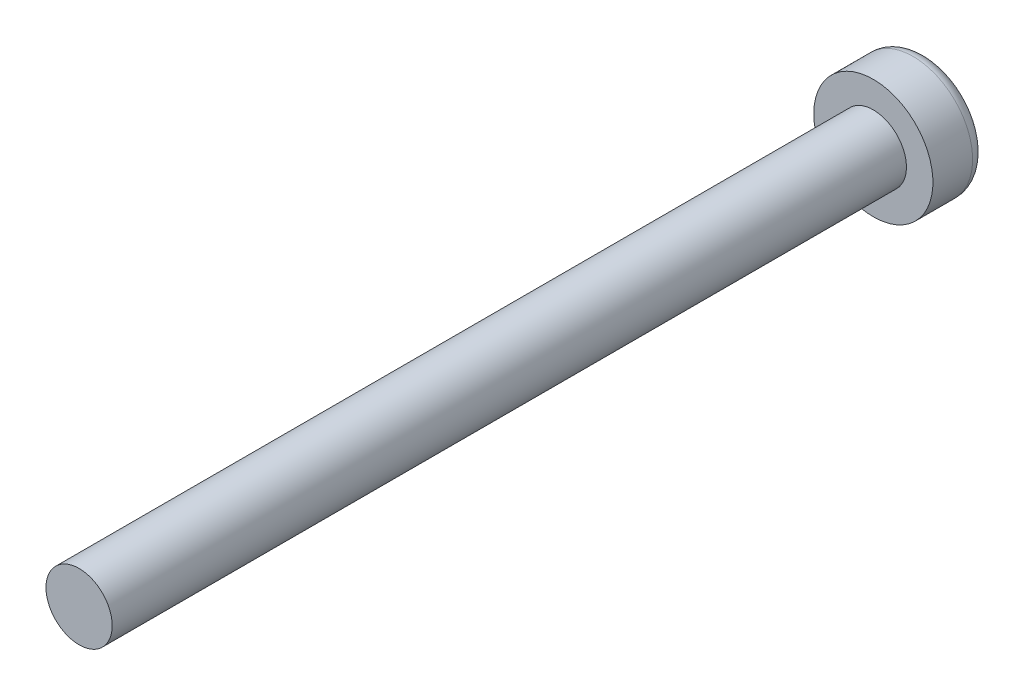
ISO-10303-21;
HEADER;
FILE_DESCRIPTION(('STEP AP214'),'2;1');
FILE_NAME('part.step','',(''),(''),'','','');
FILE_SCHEMA(('AUTOMOTIVE_DESIGN { 1 0 10303 214 1 1 1 1 }'));
ENDSEC;
DATA;
#1=APPLICATION_CONTEXT('core data for automotive mechanical design processes');
#2=APPLICATION_PROTOCOL_DEFINITION('international standard','automotive_design',2000,#1);
#3=PRODUCT_CONTEXT('',#1,'mechanical');
#4=PRODUCT('Part','Part','',(#3));
#5=PRODUCT_RELATED_PRODUCT_CATEGORY('part','',(#4));
#6=PRODUCT_DEFINITION_FORMATION('','',#4);
#7=PRODUCT_DEFINITION_CONTEXT('part definition',#1,'design');
#8=PRODUCT_DEFINITION('design','',#6,#7);
#9=PRODUCT_DEFINITION_SHAPE('','',#8);
#10=(LENGTH_UNIT() NAMED_UNIT(*) SI_UNIT(.MILLI.,.METRE.));
#11=(NAMED_UNIT(*) PLANE_ANGLE_UNIT() SI_UNIT($,.RADIAN.));
#12=(NAMED_UNIT(*) SI_UNIT($,.STERADIAN.) SOLID_ANGLE_UNIT());
#13=UNCERTAINTY_MEASURE_WITH_UNIT(LENGTH_MEASURE(1.E-05),#10,'distance_accuracy_value','');
#14=(GEOMETRIC_REPRESENTATION_CONTEXT(3) GLOBAL_UNCERTAINTY_ASSIGNED_CONTEXT((#13)) GLOBAL_UNIT_ASSIGNED_CONTEXT((#10,
#11,#12)) REPRESENTATION_CONTEXT('',''));
#15=CARTESIAN_POINT('',(0.,0.,0.));
#16=DIRECTION('',(0.,0.,1.));
#17=DIRECTION('',(1.,0.,0.));
#18=AXIS2_PLACEMENT_3D('',#15,#16,#17);
#19=CARTESIAN_POINT('',(0.,0.,60.));
#20=DIRECTION('',(0.,0.,-1.));
#21=DIRECTION('',(-1.,0.,0.));
#22=AXIS2_PLACEMENT_3D('',#19,#20,#21);
#23=CYLINDRICAL_SURFACE('',#22,2.5);
#24=CARTESIAN_POINT('',(0.,0.,60.));
#25=DIRECTION('',(0.,0.,1.));
#26=DIRECTION('',(1.,0.,0.));
#27=AXIS2_PLACEMENT_3D('',#24,#25,#26);
#28=CIRCLE('',#27,2.5);
#29=CARTESIAN_POINT('',(2.5,0.,60.));
#30=VERTEX_POINT('',#29);
#31=EDGE_CURVE('E42',#30,#30,#28,.T.);
#32=ORIENTED_EDGE('',*,*,#31,.F.);
#33=EDGE_LOOP('',(#32));
#34=FACE_BOUND('',#33,.T.);
#35=CARTESIAN_POINT('',(0.,0.,0.));
#36=DIRECTION('',(0.,0.,-1.));
#37=DIRECTION('',(-1.,0.,0.));
#38=AXIS2_PLACEMENT_3D('',#35,#36,#37);
#39=CIRCLE('',#38,2.5);
#40=CARTESIAN_POINT('',(-2.5,0.,0.));
#41=VERTEX_POINT('',#40);
#42=EDGE_CURVE('E46',#41,#41,#39,.T.);
#43=ORIENTED_EDGE('',*,*,#42,.F.);
#44=EDGE_LOOP('',(#43));
#45=FACE_BOUND('',#44,.T.);
#46=ADVANCED_FACE('F31',(#34,#45),#23,.T.);
#47=CARTESIAN_POINT('',(0.,0.,60.));
#48=DIRECTION('',(0.,0.,1.));
#49=DIRECTION('',(1.,0.,0.));
#50=AXIS2_PLACEMENT_3D('',#47,#48,#49);
#51=PLANE('',#50);
#52=ORIENTED_EDGE('',*,*,#31,.T.);
#53=EDGE_LOOP('',(#52));
#54=FACE_BOUND('',#53,.T.);
#55=ADVANCED_FACE('F60',(#54),#51,.T.);
#56=CARTESIAN_POINT('',(0.,0.,0.));
#57=DIRECTION('',(0.,0.,-1.));
#58=DIRECTION('',(-1.,0.,0.));
#59=AXIS2_PLACEMENT_3D('',#56,#57,#58);
#60=PLANE('',#59);
#61=CARTESIAN_POINT('',(0.,0.,0.));
#62=DIRECTION('',(0.,0.,-1.));
#63=DIRECTION('',(-1.,0.,0.));
#64=AXIS2_PLACEMENT_3D('',#61,#62,#63);
#65=CIRCLE('',#64,4.5);
#66=CARTESIAN_POINT('',(-4.5,0.,0.));
#67=VERTEX_POINT('',#66);
#68=EDGE_CURVE('E51',#67,#67,#65,.T.);
#69=ORIENTED_EDGE('',*,*,#68,.F.);
#70=EDGE_LOOP('',(#69));
#71=FACE_BOUND('',#70,.T.);
#72=ORIENTED_EDGE('',*,*,#42,.T.);
#73=EDGE_LOOP('',(#72));
#74=FACE_BOUND('',#73,.T.);
#75=ADVANCED_FACE('F57',(#71,#74),#60,.F.);
#76=CARTESIAN_POINT('',(0.,0.,-4.));
#77=DIRECTION('',(0.,0.,1.));
#78=DIRECTION('',(1.,0.,0.));
#79=AXIS2_PLACEMENT_3D('',#76,#77,#78);
#80=CYLINDRICAL_SURFACE('',#79,4.5);
#81=CARTESIAN_POINT('',(0.,0.,-3.));
#82=DIRECTION('',(0.,0.,-1.));
#83=DIRECTION('',(-1.,0.,0.));
#84=AXIS2_PLACEMENT_3D('',#81,#82,#83);
#85=CIRCLE('',#84,4.5);
#86=CARTESIAN_POINT('',(-4.5,0.,-3.));
#87=VERTEX_POINT('',#86);
#88=EDGE_CURVE('E10',#87,#87,#85,.F.);
#89=ORIENTED_EDGE('',*,*,#88,.T.);
#90=EDGE_LOOP('',(#89));
#91=FACE_BOUND('',#90,.T.);
#92=ORIENTED_EDGE('',*,*,#68,.T.);
#93=EDGE_LOOP('',(#92));
#94=FACE_BOUND('',#93,.T.);
#95=ADVANCED_FACE('F55',(#91,#94),#80,.T.);
#96=CARTESIAN_POINT('',(0.,0.,-4.));
#97=DIRECTION('',(0.,0.,-1.));
#98=DIRECTION('',(-1.,0.,0.));
#99=AXIS2_PLACEMENT_3D('',#96,#97,#98);
#100=PLANE('',#99);
#101=CARTESIAN_POINT('',(0.,0.,-4.));
#102=DIRECTION('',(0.,0.,-1.));
#103=DIRECTION('',(-1.,0.,0.));
#104=AXIS2_PLACEMENT_3D('',#101,#102,#103);
#105=CIRCLE('',#104,3.5);
#106=CARTESIAN_POINT('',(-3.5,0.,-4.));
#107=VERTEX_POINT('',#106);
#108=EDGE_CURVE('E38',#107,#107,#105,.T.);
#109=ORIENTED_EDGE('',*,*,#108,.T.);
#110=EDGE_LOOP('',(#109));
#111=FACE_BOUND('',#110,.T.);
#112=ADVANCED_FACE('F74',(#111),#100,.T.);
#113=CARTESIAN_POINT('',(0.,0.,-3.));
#114=DIRECTION('',(0.,0.,-1.));
#115=DIRECTION('',(-1.,0.,0.));
#116=AXIS2_PLACEMENT_3D('',#113,#114,#115);
#117=TOROIDAL_SURFACE('',#116,3.5,1.);
#118=ORIENTED_EDGE('',*,*,#88,.F.);
#119=EDGE_LOOP('',(#118));
#120=FACE_BOUND('',#119,.T.);
#121=ORIENTED_EDGE('',*,*,#108,.F.);
#122=EDGE_LOOP('',(#121));
#123=FACE_BOUND('',#122,.T.);
#124=ADVANCED_FACE('F33',(#120,#123),#117,.T.);
#125=CLOSED_SHELL('',(#46,#55,#75,#95,#112,#124));
#126=MANIFOLD_SOLID_BREP('B2',#125);
#127=ADVANCED_BREP_SHAPE_REPRESENTATION('',(#18,#126),#14);
#128=SHAPE_DEFINITION_REPRESENTATION(#9,#127);
ENDSEC;
END-ISO-10303-21;
